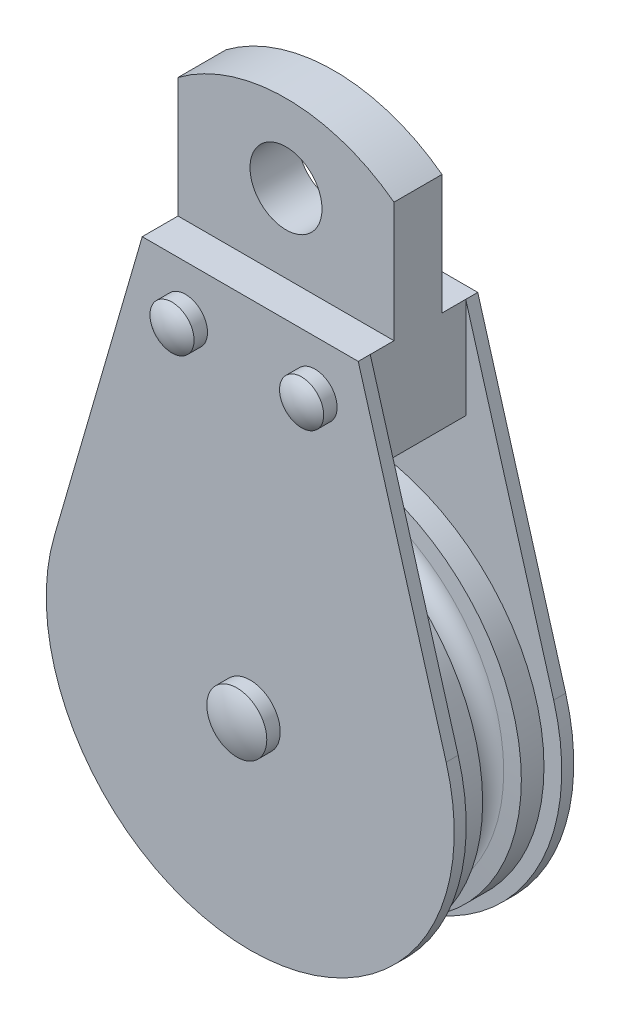
ISO-10303-21;
HEADER;
FILE_DESCRIPTION(('STEP AP214'),'2;1');
FILE_NAME('part.step','',(''),(''),'','','');
FILE_SCHEMA(('AUTOMOTIVE_DESIGN { 1 0 10303 214 1 1 1 1 }'));
ENDSEC;
DATA;
#1=APPLICATION_CONTEXT('core data for automotive mechanical design processes');
#2=APPLICATION_PROTOCOL_DEFINITION('international standard','automotive_design',2000,#1);
#3=PRODUCT_CONTEXT('',#1,'mechanical');
#4=PRODUCT('Part','Part','',(#3));
#5=PRODUCT_RELATED_PRODUCT_CATEGORY('part','',(#4));
#6=PRODUCT_DEFINITION_FORMATION('','',#4);
#7=PRODUCT_DEFINITION_CONTEXT('part definition',#1,'design');
#8=PRODUCT_DEFINITION('design','',#6,#7);
#9=PRODUCT_DEFINITION_SHAPE('','',#8);
#10=(LENGTH_UNIT() NAMED_UNIT(*) SI_UNIT(.MILLI.,.METRE.));
#11=(NAMED_UNIT(*) PLANE_ANGLE_UNIT() SI_UNIT($,.RADIAN.));
#12=(NAMED_UNIT(*) SI_UNIT($,.STERADIAN.) SOLID_ANGLE_UNIT());
#13=UNCERTAINTY_MEASURE_WITH_UNIT(LENGTH_MEASURE(1.E-05),#10,'distance_accuracy_value','');
#14=(GEOMETRIC_REPRESENTATION_CONTEXT(3) GLOBAL_UNCERTAINTY_ASSIGNED_CONTEXT((#13)) GLOBAL_UNIT_ASSIGNED_CONTEXT((#10,
#11,#12)) REPRESENTATION_CONTEXT('',''));
#15=CARTESIAN_POINT('',(0.,0.,0.));
#16=DIRECTION('',(0.,0.,1.));
#17=DIRECTION('',(1.,0.,0.));
#18=AXIS2_PLACEMENT_3D('',#15,#16,#17);
#19=CARTESIAN_POINT('',(0.,0.,-18.0175183923239));
#20=DIRECTION('',(0.,0.,1.));
#21=DIRECTION('',(1.,0.,0.));
#22=AXIS2_PLACEMENT_3D('',#19,#20,#21);
#23=CYLINDRICAL_SURFACE('',#22,3.57505);
#24=CARTESIAN_POINT('',(0.,0.,5.55625));
#25=DIRECTION('',(0.,0.,-1.));
#26=DIRECTION('',(-1.,0.,0.));
#27=AXIS2_PLACEMENT_3D('',#24,#25,#26);
#28=CIRCLE('',#27,3.57505);
#29=CARTESIAN_POINT('',(-3.57505,0.,5.55625));
#30=VERTEX_POINT('',#29);
#31=EDGE_CURVE('E283',#30,#30,#28,.T.);
#32=ORIENTED_EDGE('',*,*,#31,.F.);
#33=EDGE_LOOP('',(#32));
#34=FACE_BOUND('',#33,.T.);
#35=CARTESIAN_POINT('',(0.,0.,6.31825));
#36=DIRECTION('',(0.,0.,1.));
#37=DIRECTION('',(1.,0.,0.));
#38=AXIS2_PLACEMENT_3D('',#35,#36,#37);
#39=CIRCLE('',#38,3.57505);
#40=CARTESIAN_POINT('',(3.57505,0.,6.31825));
#41=VERTEX_POINT('',#40);
#42=EDGE_CURVE('E37',#41,#41,#39,.F.);
#43=ORIENTED_EDGE('',*,*,#42,.T.);
#44=EDGE_LOOP('',(#43));
#45=FACE_BOUND('',#44,.T.);
#46=ADVANCED_FACE('F33',(#34,#45),#23,.T.);
#47=CARTESIAN_POINT('',(0.,0.,-5.55625));
#48=DIRECTION('',(0.,0.,1.));
#49=DIRECTION('',(1.,0.,0.));
#50=AXIS2_PLACEMENT_3D('',#47,#48,#49);
#51=CIRCLE('',#50,3.57505);
#52=CARTESIAN_POINT('',(3.57505,0.,-5.55625));
#53=VERTEX_POINT('',#52);
#54=EDGE_CURVE('E279',#53,#53,#51,.T.);
#55=ORIENTED_EDGE('',*,*,#54,.F.);
#56=EDGE_LOOP('',(#55));
#57=FACE_BOUND('',#56,.T.);
#58=CARTESIAN_POINT('',(0.,0.,-6.31825));
#59=DIRECTION('',(0.,0.,-1.));
#60=DIRECTION('',(-1.,0.,0.));
#61=AXIS2_PLACEMENT_3D('',#58,#59,#60);
#62=CIRCLE('',#61,3.57505);
#63=CARTESIAN_POINT('',(-3.57505,0.,-6.31825));
#64=VERTEX_POINT('',#63);
#65=EDGE_CURVE('E253',#64,#64,#62,.F.);
#66=ORIENTED_EDGE('',*,*,#65,.T.);
#67=EDGE_LOOP('',(#66));
#68=FACE_BOUND('',#67,.T.);
#69=ADVANCED_FACE('F367',(#57,#68),#23,.T.);
#70=CARTESIAN_POINT('',(0.,0.,5.55625));
#71=DIRECTION('',(0.,0.,1.));
#72=DIRECTION('',(1.,0.,0.));
#73=AXIS2_PLACEMENT_3D('',#70,#71,#72);
#74=CYLINDRICAL_SURFACE('',#73,25.4);
#75=CARTESIAN_POINT('',(0.,0.,5.55625));
#76=DIRECTION('',(0.,0.,1.));
#77=DIRECTION('',(1.,0.,0.));
#78=AXIS2_PLACEMENT_3D('',#75,#76,#77);
#79=CIRCLE('',#78,25.4);
#80=CARTESIAN_POINT('',(25.4,0.,5.55625));
#81=VERTEX_POINT('',#80);
#82=EDGE_CURVE('E282',#81,#81,#79,.T.);
#83=ORIENTED_EDGE('',*,*,#82,.F.);
#84=EDGE_LOOP('',(#83));
#85=FACE_BOUND('',#84,.T.);
#86=CARTESIAN_POINT('',(0.,0.,2.55978965723393));
#87=DIRECTION('',(0.,0.,1.));
#88=DIRECTION('',(1.,0.,0.));
#89=AXIS2_PLACEMENT_3D('',#86,#87,#88);
#90=CIRCLE('',#89,25.4);
#91=CARTESIAN_POINT('',(25.4,0.,2.55978965723393));
#92=VERTEX_POINT('',#91);
#93=EDGE_CURVE('E11',#92,#92,#90,.T.);
#94=ORIENTED_EDGE('',*,*,#93,.T.);
#95=EDGE_LOOP('',(#94));
#96=FACE_BOUND('',#95,.T.);
#97=ADVANCED_FACE('F35',(#85,#96),#74,.T.);
#98=CARTESIAN_POINT('',(0.,0.,2.37218862483097));
#99=DIRECTION('',(0.,0.,1.));
#100=DIRECTION('',(1.,0.,0.));
#101=AXIS2_PLACEMENT_3D('',#98,#99,#100);
#102=CONICAL_SURFACE('',#101,23.2557103875821,1.48352986419518);
#103=ORIENTED_EDGE('',*,*,#93,.F.);
#104=EDGE_LOOP('',(#103));
#105=FACE_BOUND('',#104,.T.);
#106=CARTESIAN_POINT('',(0.,0.,2.37218862483097));
#107=DIRECTION('',(0.,0.,1.));
#108=DIRECTION('',(1.,0.,0.));
#109=AXIS2_PLACEMENT_3D('',#106,#107,#108);
#110=CIRCLE('',#109,23.2557103875821);
#111=CARTESIAN_POINT('',(23.2557103875821,0.,2.37218862483097));
#112=VERTEX_POINT('',#111);
#113=EDGE_CURVE('E42',#112,#112,#110,.T.);
#114=ORIENTED_EDGE('',*,*,#113,.T.);
#115=EDGE_LOOP('',(#114));
#116=FACE_BOUND('',#115,.T.);
#117=ADVANCED_FACE('F397',(#105,#116),#102,.T.);
#118=CARTESIAN_POINT('',(0.,0.,0.));
#119=DIRECTION('',(0.,0.,1.));
#120=DIRECTION('',(1.,0.,0.));
#121=AXIS2_PLACEMENT_3D('',#118,#119,#120);
#122=TOROIDAL_SURFACE('',#121,23.46325,2.38125);
#123=ORIENTED_EDGE('',*,*,#113,.F.);
#124=EDGE_LOOP('',(#123));
#125=FACE_BOUND('',#124,.T.);
#126=CARTESIAN_POINT('',(0.,0.,-2.37218862483097));
#127=DIRECTION('',(0.,0.,1.));
#128=DIRECTION('',(1.,0.,0.));
#129=AXIS2_PLACEMENT_3D('',#126,#127,#128);
#130=CIRCLE('',#129,23.2557103875821);
#131=CARTESIAN_POINT('',(23.2557103875821,0.,-2.37218862483097));
#132=VERTEX_POINT('',#131);
#133=EDGE_CURVE('E292',#132,#132,#130,.T.);
#134=ORIENTED_EDGE('',*,*,#133,.T.);
#135=EDGE_LOOP('',(#134));
#136=FACE_BOUND('',#135,.T.);
#137=ADVANCED_FACE('F394',(#125,#136),#122,.F.);
#138=CARTESIAN_POINT('',(0.,0.,-2.55978965723393));
#139=DIRECTION('',(0.,0.,-1.));
#140=DIRECTION('',(-1.,0.,0.));
#141=AXIS2_PLACEMENT_3D('',#138,#139,#140);
#142=CONICAL_SURFACE('',#141,25.4,1.48352986419518);
#143=ORIENTED_EDGE('',*,*,#133,.F.);
#144=EDGE_LOOP('',(#143));
#145=FACE_BOUND('',#144,.T.);
#146=CARTESIAN_POINT('',(0.,0.,-2.55978965723393));
#147=DIRECTION('',(0.,0.,1.));
#148=DIRECTION('',(1.,0.,0.));
#149=AXIS2_PLACEMENT_3D('',#146,#147,#148);
#150=CIRCLE('',#149,25.4);
#151=CARTESIAN_POINT('',(25.4,0.,-2.55978965723393));
#152=VERTEX_POINT('',#151);
#153=EDGE_CURVE('E289',#152,#152,#150,.T.);
#154=ORIENTED_EDGE('',*,*,#153,.T.);
#155=EDGE_LOOP('',(#154));
#156=FACE_BOUND('',#155,.T.);
#157=ADVANCED_FACE('F390',(#145,#156),#142,.T.);
#158=CARTESIAN_POINT('',(0.,0.,5.55625));
#159=DIRECTION('',(0.,0.,1.));
#160=DIRECTION('',(1.,0.,0.));
#161=AXIS2_PLACEMENT_3D('',#158,#159,#160);
#162=CYLINDRICAL_SURFACE('',#161,25.4);
#163=ORIENTED_EDGE('',*,*,#153,.F.);
#164=EDGE_LOOP('',(#163));
#165=FACE_BOUND('',#164,.T.);
#166=CARTESIAN_POINT('',(0.,0.,-5.55625));
#167=DIRECTION('',(0.,0.,1.));
#168=DIRECTION('',(1.,0.,0.));
#169=AXIS2_PLACEMENT_3D('',#166,#167,#168);
#170=CIRCLE('',#169,25.4);
#171=CARTESIAN_POINT('',(25.4,0.,-5.55625));
#172=VERTEX_POINT('',#171);
#173=EDGE_CURVE('E286',#172,#172,#170,.T.);
#174=ORIENTED_EDGE('',*,*,#173,.T.);
#175=EDGE_LOOP('',(#174));
#176=FACE_BOUND('',#175,.T.);
#177=ADVANCED_FACE('F386',(#165,#176),#162,.T.);
#178=CARTESIAN_POINT('',(0.,0.,-5.55625));
#179=DIRECTION('',(0.,0.,1.));
#180=DIRECTION('',(1.,0.,0.));
#181=AXIS2_PLACEMENT_3D('',#178,#179,#180);
#182=PLANE('',#181);
#183=ORIENTED_EDGE('',*,*,#54,.T.);
#184=EDGE_LOOP('',(#183));
#185=FACE_BOUND('',#184,.T.);
#186=ORIENTED_EDGE('',*,*,#173,.F.);
#187=EDGE_LOOP('',(#186));
#188=FACE_BOUND('',#187,.T.);
#189=ADVANCED_FACE('F382',(#185,#188),#182,.F.);
#190=CARTESIAN_POINT('',(0.,25.4,5.55625));
#191=DIRECTION('',(0.,0.,-1.));
#192=DIRECTION('',(-1.,0.,0.));
#193=AXIS2_PLACEMENT_3D('',#190,#191,#192);
#194=PLANE('',#193);
#195=ORIENTED_EDGE('',*,*,#31,.T.);
#196=EDGE_LOOP('',(#195));
#197=FACE_BOUND('',#196,.T.);
#198=ORIENTED_EDGE('',*,*,#82,.T.);
#199=EDGE_LOOP('',(#198));
#200=FACE_BOUND('',#199,.T.);
#201=ADVANCED_FACE('F379',(#197,#200),#194,.F.);
#202=CARTESIAN_POINT('',(0.,0.,-7.90575));
#203=DIRECTION('',(0.,0.,-1.));
#204=DIRECTION('',(1.,0.,0.));
#205=AXIS2_PLACEMENT_3D('',#202,#203,#204);
#206=PLANE('',#205);
#207=CARTESIAN_POINT('',(-8.57249999999999,40.9575,-7.90575));
#208=DIRECTION('',(0.,0.,-1.));
#209=DIRECTION('',(-1.,0.,0.));
#210=AXIS2_PLACEMENT_3D('',#207,#208,#209);
#211=CIRCLE('',#210,4.19100000000001);
#212=CARTESIAN_POINT('',(-12.7635,40.9575,-7.90575));
#213=VERTEX_POINT('',#212);
#214=EDGE_CURVE('E274',#213,#213,#211,.T.);
#215=ORIENTED_EDGE('',*,*,#214,.F.);
#216=EDGE_LOOP('',(#215));
#217=FACE_BOUND('',#216,.T.);
#218=DIRECTION('',(-0.278539209089311,-0.960424858591187,0.));
#219=VECTOR('',#218,1.);
#220=CARTESIAN_POINT('',(-14.2875,47.625,-7.90575));
#221=LINE('',#220,#219);
#222=CARTESIAN_POINT('',(-14.2875,47.625,-7.90575));
#223=VERTEX_POINT('',#222);
#224=CARTESIAN_POINT('',(-25.9194658712297,7.51707690529776,-7.90575));
#225=VERTEX_POINT('',#224);
#226=EDGE_CURVE('E178',#223,#225,#221,.T.);
#227=ORIENTED_EDGE('',*,*,#226,.F.);
#228=DIRECTION('',(-1.,0.,0.));
#229=VECTOR('',#228,1.);
#230=CARTESIAN_POINT('',(14.2875,47.625,-7.90575));
#231=LINE('',#230,#229);
#232=CARTESIAN_POINT('',(14.2875,47.625,-7.90575));
#233=VERTEX_POINT('',#232);
#234=EDGE_CURVE('E188',#233,#223,#231,.T.);
#235=ORIENTED_EDGE('',*,*,#234,.F.);
#236=DIRECTION('',(-0.27853920908931,0.960424858591187,0.));
#237=VECTOR('',#236,1.);
#238=CARTESIAN_POINT('',(25.9194658712297,7.51707690529777,-7.90575));
#239=LINE('',#238,#237);
#240=CARTESIAN_POINT('',(25.9194658712297,7.51707690529777,-7.90575));
#241=VERTEX_POINT('',#240);
#242=EDGE_CURVE('E185',#241,#233,#239,.T.);
#243=ORIENTED_EDGE('',*,*,#242,.F.);
#244=CARTESIAN_POINT('',(0.,0.,-7.90575));
#245=DIRECTION('',(0.,0.,1.));
#246=DIRECTION('',(1.,0.,0.));
#247=AXIS2_PLACEMENT_3D('',#244,#245,#246);
#248=CIRCLE('',#247,26.9875);
#249=EDGE_CURVE('E181',#225,#241,#248,.T.);
#250=ORIENTED_EDGE('',*,*,#249,.F.);
#251=EDGE_LOOP('',(#227,#235,#243,#250));
#252=FACE_BOUND('',#251,.T.);
#253=CARTESIAN_POINT('',(8.5725,40.9575,-7.90575));
#254=DIRECTION('',(0.,0.,-1.));
#255=DIRECTION('',(-1.,0.,0.));
#256=AXIS2_PLACEMENT_3D('',#253,#254,#255);
#257=CIRCLE('',#256,4.19100000000001);
#258=CARTESIAN_POINT('',(4.3815,40.9575,-7.90575));
#259=VERTEX_POINT('',#258);
#260=EDGE_CURVE('E270',#259,#259,#257,.T.);
#261=ORIENTED_EDGE('',*,*,#260,.F.);
#262=EDGE_LOOP('',(#261));
#263=FACE_BOUND('',#262,.T.);
#264=CARTESIAN_POINT('',(0.,0.,-7.90575));
#265=DIRECTION('',(0.,0.,-1.));
#266=DIRECTION('',(-1.,0.,0.));
#267=AXIS2_PLACEMENT_3D('',#264,#265,#266);
#268=CIRCLE('',#267,6.35);
#269=CARTESIAN_POINT('',(-6.35,0.,-7.90575));
#270=VERTEX_POINT('',#269);
#271=EDGE_CURVE('E278',#270,#270,#268,.T.);
#272=ORIENTED_EDGE('',*,*,#271,.F.);
#273=EDGE_LOOP('',(#272));
#274=FACE_BOUND('',#273,.T.);
#275=ADVANCED_FACE('F348',(#217,#252,#263,#274),#206,.T.);
#276=CARTESIAN_POINT('',(0.,0.,7.90575));
#277=DIRECTION('',(0.,0.,1.));
#278=DIRECTION('',(1.,0.,0.));
#279=AXIS2_PLACEMENT_3D('',#276,#277,#278);
#280=PLANE('',#279);
#281=CARTESIAN_POINT('',(-8.57249999999999,40.9575,7.90575));
#282=DIRECTION('',(0.,0.,1.));
#283=DIRECTION('',(1.,0.,0.));
#284=AXIS2_PLACEMENT_3D('',#281,#282,#283);
#285=CIRCLE('',#284,2.921);
#286=CARTESIAN_POINT('',(-5.65149999999999,40.9575,7.90575));
#287=VERTEX_POINT('',#286);
#288=EDGE_CURVE('E258',#287,#287,#285,.T.);
#289=ORIENTED_EDGE('',*,*,#288,.F.);
#290=EDGE_LOOP('',(#289));
#291=FACE_BOUND('',#290,.T.);
#292=DIRECTION('',(-0.278539209089311,-0.960424858591187,0.));
#293=VECTOR('',#292,1.);
#294=CARTESIAN_POINT('',(-14.2875,47.625,7.90575));
#295=LINE('',#294,#293);
#296=CARTESIAN_POINT('',(-14.2875,47.625,7.90575));
#297=VERTEX_POINT('',#296);
#298=CARTESIAN_POINT('',(-25.9194658712297,7.51707690529776,7.90575));
#299=VERTEX_POINT('',#298);
#300=EDGE_CURVE('E225',#297,#299,#295,.T.);
#301=ORIENTED_EDGE('',*,*,#300,.T.);
#302=CARTESIAN_POINT('',(0.,0.,7.90575));
#303=DIRECTION('',(0.,0.,1.));
#304=DIRECTION('',(1.,0.,0.));
#305=AXIS2_PLACEMENT_3D('',#302,#303,#304);
#306=CIRCLE('',#305,26.9875);
#307=CARTESIAN_POINT('',(25.9194658712297,7.51707690529777,7.90575));
#308=VERTEX_POINT('',#307);
#309=EDGE_CURVE('E228',#299,#308,#306,.T.);
#310=ORIENTED_EDGE('',*,*,#309,.T.);
#311=DIRECTION('',(-0.27853920908931,0.960424858591187,0.));
#312=VECTOR('',#311,1.);
#313=CARTESIAN_POINT('',(25.9194658712297,7.51707690529777,7.90575));
#314=LINE('',#313,#312);
#315=CARTESIAN_POINT('',(14.2875,47.625,7.90575));
#316=VERTEX_POINT('',#315);
#317=EDGE_CURVE('E231',#308,#316,#314,.T.);
#318=ORIENTED_EDGE('',*,*,#317,.T.);
#319=DIRECTION('',(-1.,0.,0.));
#320=VECTOR('',#319,1.);
#321=CARTESIAN_POINT('',(14.2875,47.625,7.90575));
#322=LINE('',#321,#320);
#323=EDGE_CURVE('E233',#316,#297,#322,.T.);
#324=ORIENTED_EDGE('',*,*,#323,.T.);
#325=EDGE_LOOP('',(#301,#310,#318,#324));
#326=FACE_BOUND('',#325,.T.);
#327=CARTESIAN_POINT('',(0.,0.,7.90575));
#328=DIRECTION('',(0.,0.,1.));
#329=DIRECTION('',(1.,0.,0.));
#330=AXIS2_PLACEMENT_3D('',#327,#328,#329);
#331=CIRCLE('',#330,3.96875);
#332=CARTESIAN_POINT('',(3.96875,0.,7.90575));
#333=VERTEX_POINT('',#332);
#334=EDGE_CURVE('E257',#333,#333,#331,.T.);
#335=ORIENTED_EDGE('',*,*,#334,.F.);
#336=EDGE_LOOP('',(#335));
#337=FACE_BOUND('',#336,.T.);
#338=CARTESIAN_POINT('',(8.5725,40.9575,7.90575));
#339=DIRECTION('',(0.,0.,1.));
#340=DIRECTION('',(1.,0.,0.));
#341=AXIS2_PLACEMENT_3D('',#338,#339,#340);
#342=CIRCLE('',#341,2.921);
#343=CARTESIAN_POINT('',(11.4935,40.9575,7.90575));
#344=VERTEX_POINT('',#343);
#345=EDGE_CURVE('E262',#344,#344,#342,.T.);
#346=ORIENTED_EDGE('',*,*,#345,.F.);
#347=EDGE_LOOP('',(#346));
#348=FACE_BOUND('',#347,.T.);
#349=ADVANCED_FACE('F326',(#291,#326,#337,#348),#280,.T.);
#350=CARTESIAN_POINT('',(14.2875,47.625,7.90575));
#351=DIRECTION('',(0.,-1.,0.));
#352=DIRECTION('',(0.,0.,-1.));
#353=AXIS2_PLACEMENT_3D('',#350,#351,#352);
#354=PLANE('',#353);
#355=DIRECTION('',(-1.,0.,0.));
#356=VECTOR('',#355,1.);
#357=CARTESIAN_POINT('',(14.2875,47.625,-3.175));
#358=LINE('',#357,#356);
#359=CARTESIAN_POINT('',(14.2875,47.625,-3.175));
#360=VERTEX_POINT('',#359);
#361=CARTESIAN_POINT('',(-14.2875,47.625,-3.175));
#362=VERTEX_POINT('',#361);
#363=EDGE_CURVE('E159',#360,#362,#358,.T.);
#364=ORIENTED_EDGE('',*,*,#363,.F.);
#365=DIRECTION('',(0.,0.,1.));
#366=VECTOR('',#365,1.);
#367=CARTESIAN_POINT('',(14.2875,47.625,-31.5333609055553));
#368=LINE('',#367,#366);
#369=CARTESIAN_POINT('',(14.2875,47.625,-6.31825));
#370=VERTEX_POINT('',#369);
#371=EDGE_CURVE('E215',#370,#360,#368,.T.);
#372=ORIENTED_EDGE('',*,*,#371,.F.);
#373=DIRECTION('',(0.,0.,1.));
#374=VECTOR('',#373,1.);
#375=CARTESIAN_POINT('',(14.2875,47.625,-7.90575));
#376=LINE('',#375,#374);
#377=EDGE_CURVE('E200',#233,#370,#376,.T.);
#378=ORIENTED_EDGE('',*,*,#377,.F.);
#379=ORIENTED_EDGE('',*,*,#234,.T.);
#380=DIRECTION('',(0.,0.,1.));
#381=VECTOR('',#380,1.);
#382=CARTESIAN_POINT('',(-14.2875,47.625,-7.90575));
#383=LINE('',#382,#381);
#384=CARTESIAN_POINT('',(-14.2875,47.625,-6.31825));
#385=VERTEX_POINT('',#384);
#386=EDGE_CURVE('E190',#223,#385,#383,.T.);
#387=ORIENTED_EDGE('',*,*,#386,.T.);
#388=DIRECTION('',(0.,0.,1.));
#389=VECTOR('',#388,1.);
#390=CARTESIAN_POINT('',(-14.2875,47.625,-31.5333609055553));
#391=LINE('',#390,#389);
#392=EDGE_CURVE('E218',#385,#362,#391,.T.);
#393=ORIENTED_EDGE('',*,*,#392,.T.);
#394=EDGE_LOOP('',(#364,#372,#378,#379,#387,#393));
#395=FACE_BOUND('',#394,.T.);
#396=ADVANCED_FACE('F309',(#395),#354,.F.);
#397=CARTESIAN_POINT('',(0.,0.,6.31825));
#398=DIRECTION('',(0.,0.,1.));
#399=DIRECTION('',(1.,0.,0.));
#400=AXIS2_PLACEMENT_3D('',#397,#398,#399);
#401=PLANE('',#400);
#402=ORIENTED_EDGE('',*,*,#42,.F.);
#403=EDGE_LOOP('',(#402));
#404=FACE_BOUND('',#403,.T.);
#405=DIRECTION('',(0.,-1.,0.));
#406=VECTOR('',#405,1.);
#407=CARTESIAN_POINT('',(14.2875,47.625,6.31825));
#408=LINE('',#407,#406);
#409=CARTESIAN_POINT('',(14.2875,47.625,6.31825));
#410=VERTEX_POINT('',#409);
#411=CARTESIAN_POINT('',(14.2875,34.29,6.31825));
#412=VERTEX_POINT('',#411);
#413=EDGE_CURVE('E207',#410,#412,#408,.T.);
#414=ORIENTED_EDGE('',*,*,#413,.F.);
#415=DIRECTION('',(-0.27853920908931,0.960424858591187,0.));
#416=VECTOR('',#415,1.);
#417=CARTESIAN_POINT('',(25.9194658712297,7.51707690529777,6.31825));
#418=LINE('',#417,#416);
#419=CARTESIAN_POINT('',(25.9194658712297,7.51707690529777,6.31825));
#420=VERTEX_POINT('',#419);
#421=EDGE_CURVE('E229',#420,#410,#418,.T.);
#422=ORIENTED_EDGE('',*,*,#421,.F.);
#423=CARTESIAN_POINT('',(0.,0.,6.31825));
#424=DIRECTION('',(0.,0.,1.));
#425=DIRECTION('',(1.,0.,0.));
#426=AXIS2_PLACEMENT_3D('',#423,#424,#425);
#427=CIRCLE('',#426,26.9875);
#428=CARTESIAN_POINT('',(-25.9194658712297,7.51707690529776,6.31825));
#429=VERTEX_POINT('',#428);
#430=EDGE_CURVE('E238',#429,#420,#427,.T.);
#431=ORIENTED_EDGE('',*,*,#430,.F.);
#432=DIRECTION('',(-0.278539209089311,-0.960424858591187,0.));
#433=VECTOR('',#432,1.);
#434=CARTESIAN_POINT('',(-14.2875,47.625,6.31825));
#435=LINE('',#434,#433);
#436=CARTESIAN_POINT('',(-14.2875,47.625,6.31825));
#437=VERTEX_POINT('',#436);
#438=EDGE_CURVE('E224',#437,#429,#435,.T.);
#439=ORIENTED_EDGE('',*,*,#438,.F.);
#440=DIRECTION('',(0.,1.,0.));
#441=VECTOR('',#440,1.);
#442=CARTESIAN_POINT('',(-14.2875,47.625,6.31825));
#443=LINE('',#442,#441);
#444=CARTESIAN_POINT('',(-14.2875,34.29,6.31825));
#445=VERTEX_POINT('',#444);
#446=EDGE_CURVE('E212',#445,#437,#443,.T.);
#447=ORIENTED_EDGE('',*,*,#446,.F.);
#448=DIRECTION('',(-1.,0.,0.));
#449=VECTOR('',#448,1.);
#450=CARTESIAN_POINT('',(14.2875,34.29,6.31825));
#451=LINE('',#450,#449);
#452=EDGE_CURVE('E210',#412,#445,#451,.T.);
#453=ORIENTED_EDGE('',*,*,#452,.F.);
#454=EDGE_LOOP('',(#414,#422,#431,#439,#447,#453));
#455=FACE_BOUND('',#454,.T.);
#456=ADVANCED_FACE('F305',(#404,#455),#401,.F.);
#457=CARTESIAN_POINT('',(-14.2875,47.625,7.90575));
#458=DIRECTION('',(0.960424858591187,-0.278539209089311,0.));
#459=DIRECTION('',(0.278539209089311,0.960424858591187,0.));
#460=AXIS2_PLACEMENT_3D('',#457,#458,#459);
#461=PLANE('',#460);
#462=ORIENTED_EDGE('',*,*,#438,.T.);
#463=DIRECTION('',(0.,0.,-1.));
#464=VECTOR('',#463,1.);
#465=CARTESIAN_POINT('',(-25.9194658712297,7.51707690529776,7.90575));
#466=LINE('',#465,#464);
#467=EDGE_CURVE('E250',#299,#429,#466,.T.);
#468=ORIENTED_EDGE('',*,*,#467,.F.);
#469=ORIENTED_EDGE('',*,*,#300,.F.);
#470=DIRECTION('',(0.,0.,-1.));
#471=VECTOR('',#470,1.);
#472=CARTESIAN_POINT('',(-14.2875,47.625,7.90575));
#473=LINE('',#472,#471);
#474=EDGE_CURVE('E235',#297,#437,#473,.T.);
#475=ORIENTED_EDGE('',*,*,#474,.T.);
#476=EDGE_LOOP('',(#462,#468,#469,#475));
#477=FACE_BOUND('',#476,.T.);
#478=ADVANCED_FACE('F308',(#477),#461,.F.);
#479=CARTESIAN_POINT('',(0.,0.,7.90575));
#480=DIRECTION('',(0.,0.,-1.));
#481=DIRECTION('',(-1.,0.,0.));
#482=AXIS2_PLACEMENT_3D('',#479,#480,#481);
#483=CYLINDRICAL_SURFACE('',#482,26.9875);
#484=ORIENTED_EDGE('',*,*,#430,.T.);
#485=DIRECTION('',(0.,0.,-1.));
#486=VECTOR('',#485,1.);
#487=CARTESIAN_POINT('',(25.9194658712297,7.51707690529777,7.90575));
#488=LINE('',#487,#486);
#489=EDGE_CURVE('E247',#308,#420,#488,.T.);
#490=ORIENTED_EDGE('',*,*,#489,.F.);
#491=ORIENTED_EDGE('',*,*,#309,.F.);
#492=ORIENTED_EDGE('',*,*,#467,.T.);
#493=EDGE_LOOP('',(#484,#490,#491,#492));
#494=FACE_BOUND('',#493,.T.);
#495=ADVANCED_FACE('F330',(#494),#483,.T.);
#496=CARTESIAN_POINT('',(25.9194658712297,7.51707690529777,7.90575));
#497=DIRECTION('',(-0.960424858591187,-0.27853920908931,0.));
#498=DIRECTION('',(0.278539209089311,-0.960424858591187,0.));
#499=AXIS2_PLACEMENT_3D('',#496,#497,#498);
#500=PLANE('',#499);
#501=ORIENTED_EDGE('',*,*,#421,.T.);
#502=DIRECTION('',(0.,0.,-1.));
#503=VECTOR('',#502,1.);
#504=CARTESIAN_POINT('',(14.2875,47.625,7.90575));
#505=LINE('',#504,#503);
#506=EDGE_CURVE('E244',#316,#410,#505,.T.);
#507=ORIENTED_EDGE('',*,*,#506,.F.);
#508=ORIENTED_EDGE('',*,*,#317,.F.);
#509=ORIENTED_EDGE('',*,*,#489,.T.);
#510=EDGE_LOOP('',(#501,#507,#508,#509));
#511=FACE_BOUND('',#510,.T.);
#512=ADVANCED_FACE('F316',(#511),#500,.F.);
#513=CARTESIAN_POINT('',(14.2875,47.625,3.175));
#514=VERTEX_POINT('',#513);
#515=EDGE_CURVE('E214',#514,#410,#368,.T.);
#516=ORIENTED_EDGE('',*,*,#515,.F.);
#517=DIRECTION('',(-1.,0.,0.));
#518=VECTOR('',#517,1.);
#519=CARTESIAN_POINT('',(14.2875,47.625,3.175));
#520=LINE('',#519,#518);
#521=CARTESIAN_POINT('',(-14.2875,47.625,3.175));
#522=VERTEX_POINT('',#521);
#523=EDGE_CURVE('E162',#514,#522,#520,.T.);
#524=ORIENTED_EDGE('',*,*,#523,.T.);
#525=EDGE_CURVE('E145',#522,#437,#391,.T.);
#526=ORIENTED_EDGE('',*,*,#525,.T.);
#527=ORIENTED_EDGE('',*,*,#474,.F.);
#528=ORIENTED_EDGE('',*,*,#323,.F.);
#529=ORIENTED_EDGE('',*,*,#506,.T.);
#530=EDGE_LOOP('',(#516,#524,#526,#527,#528,#529));
#531=FACE_BOUND('',#530,.T.);
#532=ADVANCED_FACE('F322',(#531),#354,.F.);
#533=CARTESIAN_POINT('',(-14.2875,47.625,-31.5333609055553));
#534=DIRECTION('',(1.,0.,0.));
#535=DIRECTION('',(0.,1.,0.));
#536=AXIS2_PLACEMENT_3D('',#533,#534,#535);
#537=PLANE('',#536);
#538=ORIENTED_EDGE('',*,*,#525,.F.);
#539=DIRECTION('',(0.,-1.,0.));
#540=VECTOR('',#539,1.);
#541=CARTESIAN_POINT('',(-14.2875,63.5,3.175));
#542=LINE('',#541,#540);
#543=CARTESIAN_POINT('',(-14.2875,63.5,3.175));
#544=VERTEX_POINT('',#543);
#545=EDGE_CURVE('E137',#544,#522,#542,.T.);
#546=ORIENTED_EDGE('',*,*,#545,.F.);
#547=DIRECTION('',(0.,0.,-1.));
#548=VECTOR('',#547,1.);
#549=CARTESIAN_POINT('',(-14.2875,63.5,3.175));
#550=LINE('',#549,#548);
#551=CARTESIAN_POINT('',(-14.2875,63.5,-3.175));
#552=VERTEX_POINT('',#551);
#553=EDGE_CURVE('E142',#544,#552,#550,.T.);
#554=ORIENTED_EDGE('',*,*,#553,.T.);
#555=DIRECTION('',(0.,-1.,0.));
#556=VECTOR('',#555,1.);
#557=CARTESIAN_POINT('',(-14.2875,63.5,-3.175));
#558=LINE('',#557,#556);
#559=EDGE_CURVE('E745',#552,#362,#558,.T.);
#560=ORIENTED_EDGE('',*,*,#559,.T.);
#561=ORIENTED_EDGE('',*,*,#392,.F.);
#562=DIRECTION('',(0.,1.,0.));
#563=VECTOR('',#562,1.);
#564=CARTESIAN_POINT('',(-14.2875,47.625,-6.31825));
#565=LINE('',#564,#563);
#566=CARTESIAN_POINT('',(-14.2875,34.29,-6.31825));
#567=VERTEX_POINT('',#566);
#568=EDGE_CURVE('E174',#567,#385,#565,.T.);
#569=ORIENTED_EDGE('',*,*,#568,.F.);
#570=DIRECTION('',(0.,0.,1.));
#571=VECTOR('',#570,1.);
#572=CARTESIAN_POINT('',(-14.2875,34.29,-31.5333609055553));
#573=LINE('',#572,#571);
#574=EDGE_CURVE('E221',#567,#445,#573,.T.);
#575=ORIENTED_EDGE('',*,*,#574,.T.);
#576=ORIENTED_EDGE('',*,*,#446,.T.);
#577=EDGE_LOOP('',(#538,#546,#554,#560,#561,#569,#575,#576));
#578=FACE_BOUND('',#577,.T.);
#579=ADVANCED_FACE('F139',(#578),#537,.F.);
#580=CARTESIAN_POINT('',(14.2875,34.29,-31.5333609055553));
#581=DIRECTION('',(0.,1.,0.));
#582=DIRECTION('',(0.,0.,1.));
#583=AXIS2_PLACEMENT_3D('',#580,#581,#582);
#584=PLANE('',#583);
#585=ORIENTED_EDGE('',*,*,#452,.T.);
#586=ORIENTED_EDGE('',*,*,#574,.F.);
#587=DIRECTION('',(-1.,0.,0.));
#588=VECTOR('',#587,1.);
#589=CARTESIAN_POINT('',(14.2875,34.29,-6.31825));
#590=LINE('',#589,#588);
#591=CARTESIAN_POINT('',(14.2875,34.29,-6.31825));
#592=VERTEX_POINT('',#591);
#593=EDGE_CURVE('E171',#592,#567,#590,.T.);
#594=ORIENTED_EDGE('',*,*,#593,.F.);
#595=DIRECTION('',(0.,0.,1.));
#596=VECTOR('',#595,1.);
#597=CARTESIAN_POINT('',(14.2875,34.29,-31.5333609055553));
#598=LINE('',#597,#596);
#599=EDGE_CURVE('E58',#592,#412,#598,.T.);
#600=ORIENTED_EDGE('',*,*,#599,.T.);
#601=EDGE_LOOP('',(#585,#586,#594,#600));
#602=FACE_BOUND('',#601,.T.);
#603=ADVANCED_FACE('F334',(#602),#584,.F.);
#604=CARTESIAN_POINT('',(14.2875,47.625,-31.5333609055553));
#605=DIRECTION('',(-1.,0.,0.));
#606=DIRECTION('',(0.,-1.,0.));
#607=AXIS2_PLACEMENT_3D('',#604,#605,#606);
#608=PLANE('',#607);
#609=ORIENTED_EDGE('',*,*,#413,.T.);
#610=ORIENTED_EDGE('',*,*,#599,.F.);
#611=DIRECTION('',(0.,-1.,0.));
#612=VECTOR('',#611,1.);
#613=CARTESIAN_POINT('',(14.2875,47.625,-6.31825));
#614=LINE('',#613,#612);
#615=EDGE_CURVE('E168',#370,#592,#614,.T.);
#616=ORIENTED_EDGE('',*,*,#615,.F.);
#617=ORIENTED_EDGE('',*,*,#371,.T.);
#618=DIRECTION('',(0.,1.,0.));
#619=VECTOR('',#618,1.);
#620=CARTESIAN_POINT('',(14.2875,63.5,-3.175));
#621=LINE('',#620,#619);
#622=CARTESIAN_POINT('',(14.2875,63.5,-3.175));
#623=VERTEX_POINT('',#622);
#624=EDGE_CURVE('E154',#360,#623,#621,.T.);
#625=ORIENTED_EDGE('',*,*,#624,.T.);
#626=DIRECTION('',(0.,0.,-1.));
#627=VECTOR('',#626,1.);
#628=CARTESIAN_POINT('',(14.2875,63.5,3.175));
#629=LINE('',#628,#627);
#630=CARTESIAN_POINT('',(14.2875,63.5,3.175));
#631=VERTEX_POINT('',#630);
#632=EDGE_CURVE('E160',#631,#623,#629,.T.);
#633=ORIENTED_EDGE('',*,*,#632,.F.);
#634=DIRECTION('',(0.,1.,0.));
#635=VECTOR('',#634,1.);
#636=CARTESIAN_POINT('',(14.2875,63.5,3.175));
#637=LINE('',#636,#635);
#638=EDGE_CURVE('E50',#514,#631,#637,.T.);
#639=ORIENTED_EDGE('',*,*,#638,.F.);
#640=ORIENTED_EDGE('',*,*,#515,.T.);
#641=EDGE_LOOP('',(#609,#610,#616,#617,#625,#633,#639,#640));
#642=FACE_BOUND('',#641,.T.);
#643=ADVANCED_FACE('F339',(#642),#608,.F.);
#644=CARTESIAN_POINT('',(0.,0.,-6.31825));
#645=DIRECTION('',(0.,0.,-1.));
#646=DIRECTION('',(1.,0.,0.));
#647=AXIS2_PLACEMENT_3D('',#644,#645,#646);
#648=PLANE('',#647);
#649=ORIENTED_EDGE('',*,*,#65,.F.);
#650=EDGE_LOOP('',(#649));
#651=FACE_BOUND('',#650,.T.);
#652=ORIENTED_EDGE('',*,*,#615,.T.);
#653=ORIENTED_EDGE('',*,*,#593,.T.);
#654=ORIENTED_EDGE('',*,*,#568,.T.);
#655=DIRECTION('',(-0.278539209089311,-0.960424858591187,0.));
#656=VECTOR('',#655,1.);
#657=CARTESIAN_POINT('',(-14.2875,47.625,-6.31825));
#658=LINE('',#657,#656);
#659=CARTESIAN_POINT('',(-25.9194658712297,7.51707690529776,-6.31825));
#660=VERTEX_POINT('',#659);
#661=EDGE_CURVE('E177',#385,#660,#658,.T.);
#662=ORIENTED_EDGE('',*,*,#661,.T.);
#663=CARTESIAN_POINT('',(0.,0.,-6.31825));
#664=DIRECTION('',(0.,0.,1.));
#665=DIRECTION('',(1.,0.,0.));
#666=AXIS2_PLACEMENT_3D('',#663,#664,#665);
#667=CIRCLE('',#666,26.9875);
#668=CARTESIAN_POINT('',(25.9194658712297,7.51707690529777,-6.31825));
#669=VERTEX_POINT('',#668);
#670=EDGE_CURVE('E193',#660,#669,#667,.T.);
#671=ORIENTED_EDGE('',*,*,#670,.T.);
#672=DIRECTION('',(-0.27853920908931,0.960424858591187,0.));
#673=VECTOR('',#672,1.);
#674=CARTESIAN_POINT('',(25.9194658712297,7.51707690529777,-6.31825));
#675=LINE('',#674,#673);
#676=EDGE_CURVE('E182',#669,#370,#675,.T.);
#677=ORIENTED_EDGE('',*,*,#676,.T.);
#678=EDGE_LOOP('',(#652,#653,#654,#662,#671,#677));
#679=FACE_BOUND('',#678,.T.);
#680=ADVANCED_FACE('F337',(#651,#679),#648,.F.);
#681=CARTESIAN_POINT('',(-14.2875,47.625,-7.90575));
#682=DIRECTION('',(0.960424858591187,-0.278539209089311,0.));
#683=DIRECTION('',(0.278539209089311,0.960424858591187,0.));
#684=AXIS2_PLACEMENT_3D('',#681,#682,#683);
#685=PLANE('',#684);
#686=ORIENTED_EDGE('',*,*,#661,.F.);
#687=ORIENTED_EDGE('',*,*,#386,.F.);
#688=ORIENTED_EDGE('',*,*,#226,.T.);
#689=DIRECTION('',(0.,0.,1.));
#690=VECTOR('',#689,1.);
#691=CARTESIAN_POINT('',(-25.9194658712297,7.51707690529776,-7.90575));
#692=LINE('',#691,#690);
#693=EDGE_CURVE('E205',#225,#660,#692,.T.);
#694=ORIENTED_EDGE('',*,*,#693,.T.);
#695=EDGE_LOOP('',(#686,#687,#688,#694));
#696=FACE_BOUND('',#695,.T.);
#697=ADVANCED_FACE('F354',(#696),#685,.F.);
#698=CARTESIAN_POINT('',(0.,0.,-7.90575));
#699=DIRECTION('',(0.,0.,1.));
#700=DIRECTION('',(-1.,0.,0.));
#701=AXIS2_PLACEMENT_3D('',#698,#699,#700);
#702=CYLINDRICAL_SURFACE('',#701,26.9875);
#703=ORIENTED_EDGE('',*,*,#670,.F.);
#704=ORIENTED_EDGE('',*,*,#693,.F.);
#705=ORIENTED_EDGE('',*,*,#249,.T.);
#706=DIRECTION('',(0.,0.,1.));
#707=VECTOR('',#706,1.);
#708=CARTESIAN_POINT('',(25.9194658712297,7.51707690529777,-7.90575));
#709=LINE('',#708,#707);
#710=EDGE_CURVE('E203',#241,#669,#709,.T.);
#711=ORIENTED_EDGE('',*,*,#710,.T.);
#712=EDGE_LOOP('',(#703,#704,#705,#711));
#713=FACE_BOUND('',#712,.T.);
#714=ADVANCED_FACE('F357',(#713),#702,.T.);
#715=CARTESIAN_POINT('',(25.9194658712297,7.51707690529777,-7.90575));
#716=DIRECTION('',(-0.960424858591187,-0.27853920908931,0.));
#717=DIRECTION('',(0.278539209089311,-0.960424858591187,0.));
#718=AXIS2_PLACEMENT_3D('',#715,#716,#717);
#719=PLANE('',#718);
#720=ORIENTED_EDGE('',*,*,#676,.F.);
#721=ORIENTED_EDGE('',*,*,#710,.F.);
#722=ORIENTED_EDGE('',*,*,#242,.T.);
#723=ORIENTED_EDGE('',*,*,#377,.T.);
#724=EDGE_LOOP('',(#720,#721,#722,#723));
#725=FACE_BOUND('',#724,.T.);
#726=ADVANCED_FACE('F344',(#725),#719,.F.);
#727=CARTESIAN_POINT('',(0.,44.45,3.175));
#728=DIRECTION('',(0.,0.,1.));
#729=DIRECTION('',(1.,0.,0.));
#730=AXIS2_PLACEMENT_3D('',#727,#728,#729);
#731=PLANE('',#730);
#732=CARTESIAN_POINT('',(0.,57.94375,3.175));
#733=DIRECTION('',(0.,0.,1.));
#734=DIRECTION('',(1.,0.,0.));
#735=AXIS2_PLACEMENT_3D('',#732,#733,#734);
#736=CIRCLE('',#735,4.7625);
#737=CARTESIAN_POINT('',(4.7625,57.94375,3.175));
#738=VERTEX_POINT('',#737);
#739=EDGE_CURVE('E738',#738,#738,#736,.T.);
#740=ORIENTED_EDGE('',*,*,#739,.F.);
#741=EDGE_LOOP('',(#740));
#742=FACE_BOUND('',#741,.T.);
#743=ORIENTED_EDGE('',*,*,#523,.F.);
#744=ORIENTED_EDGE('',*,*,#638,.T.);
#745=CARTESIAN_POINT('',(0.,44.45,3.175));
#746=DIRECTION('',(0.,0.,1.));
#747=DIRECTION('',(1.,0.,0.));
#748=AXIS2_PLACEMENT_3D('',#745,#746,#747);
#749=CIRCLE('',#748,23.8125);
#750=EDGE_CURVE('E148',#631,#544,#749,.T.);
#751=ORIENTED_EDGE('',*,*,#750,.T.);
#752=ORIENTED_EDGE('',*,*,#545,.T.);
#753=EDGE_LOOP('',(#743,#744,#751,#752));
#754=FACE_BOUND('',#753,.T.);
#755=ADVANCED_FACE('F151',(#742,#754),#731,.T.);
#756=CARTESIAN_POINT('',(0.,44.45,-3.175));
#757=DIRECTION('',(0.,0.,1.));
#758=DIRECTION('',(1.,0.,0.));
#759=AXIS2_PLACEMENT_3D('',#756,#757,#758);
#760=PLANE('',#759);
#761=CARTESIAN_POINT('',(0.,57.94375,-3.175));
#762=DIRECTION('',(0.,0.,1.));
#763=DIRECTION('',(1.,0.,0.));
#764=AXIS2_PLACEMENT_3D('',#761,#762,#763);
#765=CIRCLE('',#764,4.7625);
#766=CARTESIAN_POINT('',(4.7625,57.94375,-3.175));
#767=VERTEX_POINT('',#766);
#768=EDGE_CURVE('E266',#767,#767,#765,.T.);
#769=ORIENTED_EDGE('',*,*,#768,.T.);
#770=EDGE_LOOP('',(#769));
#771=FACE_BOUND('',#770,.T.);
#772=ORIENTED_EDGE('',*,*,#624,.F.);
#773=ORIENTED_EDGE('',*,*,#363,.T.);
#774=ORIENTED_EDGE('',*,*,#559,.F.);
#775=CARTESIAN_POINT('',(0.,44.45,-3.175));
#776=DIRECTION('',(0.,0.,1.));
#777=DIRECTION('',(1.,0.,0.));
#778=AXIS2_PLACEMENT_3D('',#775,#776,#777);
#779=CIRCLE('',#778,23.8125);
#780=EDGE_CURVE('E158',#623,#552,#779,.T.);
#781=ORIENTED_EDGE('',*,*,#780,.F.);
#782=EDGE_LOOP('',(#772,#773,#774,#781));
#783=FACE_BOUND('',#782,.T.);
#784=ADVANCED_FACE('F570',(#771,#783),#760,.F.);
#785=CARTESIAN_POINT('',(0.,44.45,3.175));
#786=DIRECTION('',(0.,0.,-1.));
#787=DIRECTION('',(-1.,0.,0.));
#788=AXIS2_PLACEMENT_3D('',#785,#786,#787);
#789=CYLINDRICAL_SURFACE('',#788,23.8125);
#790=ORIENTED_EDGE('',*,*,#780,.T.);
#791=ORIENTED_EDGE('',*,*,#553,.F.);
#792=ORIENTED_EDGE('',*,*,#750,.F.);
#793=ORIENTED_EDGE('',*,*,#632,.T.);
#794=EDGE_LOOP('',(#790,#791,#792,#793));
#795=FACE_BOUND('',#794,.T.);
#796=ADVANCED_FACE('F156',(#795),#789,.T.);
#797=CARTESIAN_POINT('',(0.,57.94375,3.175));
#798=DIRECTION('',(0.,0.,-1.));
#799=DIRECTION('',(-1.,0.,0.));
#800=AXIS2_PLACEMENT_3D('',#797,#798,#799);
#801=CYLINDRICAL_SURFACE('',#800,4.7625);
#802=ORIENTED_EDGE('',*,*,#739,.T.);
#803=EDGE_LOOP('',(#802));
#804=FACE_BOUND('',#803,.T.);
#805=ORIENTED_EDGE('',*,*,#768,.F.);
#806=EDGE_LOOP('',(#805));
#807=FACE_BOUND('',#806,.T.);
#808=ADVANCED_FACE('F589',(#804,#807),#801,.F.);
#809=CARTESIAN_POINT('',(0.,0.,9.68375));
#810=DIRECTION('',(0.,0.,-1.));
#811=DIRECTION('',(-1.,0.,0.));
#812=AXIS2_PLACEMENT_3D('',#809,#810,#811);
#813=CYLINDRICAL_SURFACE('',#812,3.96875);
#814=CARTESIAN_POINT('',(0.,0.,9.68375));
#815=DIRECTION('',(0.,0.,1.));
#816=DIRECTION('',(1.,0.,0.));
#817=AXIS2_PLACEMENT_3D('',#814,#815,#816);
#818=CIRCLE('',#817,3.96875);
#819=CARTESIAN_POINT('',(3.96875,0.,9.68375));
#820=VERTEX_POINT('',#819);
#821=EDGE_CURVE('E263',#820,#820,#818,.T.);
#822=ORIENTED_EDGE('',*,*,#821,.F.);
#823=EDGE_LOOP('',(#822));
#824=FACE_BOUND('',#823,.T.);
#825=ORIENTED_EDGE('',*,*,#334,.T.);
#826=EDGE_LOOP('',(#825));
#827=FACE_BOUND('',#826,.T.);
#828=ADVANCED_FACE('F598',(#824,#827),#813,.T.);
#829=CARTESIAN_POINT('',(0.,0.,2.44028515625));
#830=DIRECTION('',(0.,0.,1.));
#831=DIRECTION('',(1.,0.,0.));
#832=AXIS2_PLACEMENT_3D('',#829,#830,#831);
#833=SPHERICAL_SURFACE('',#832,8.25946484375);
#834=ORIENTED_EDGE('',*,*,#821,.T.);
#835=EDGE_LOOP('',(#834));
#836=FACE_BOUND('',#835,.T.);
#837=ADVANCED_FACE('F608',(#836),#833,.T.);
#838=CARTESIAN_POINT('',(-8.57249999999999,40.9575,9.68375));
#839=DIRECTION('',(0.,0.,-1.));
#840=DIRECTION('',(-1.,0.,0.));
#841=AXIS2_PLACEMENT_3D('',#838,#839,#840);
#842=CYLINDRICAL_SURFACE('',#841,2.921);
#843=CARTESIAN_POINT('',(-8.57249999999999,40.9575,9.68375));
#844=DIRECTION('',(0.,0.,1.));
#845=DIRECTION('',(1.,0.,0.));
#846=AXIS2_PLACEMENT_3D('',#843,#844,#845);
#847=CIRCLE('',#846,2.921);
#848=CARTESIAN_POINT('',(-5.65149999999999,40.9575,9.68375));
#849=VERTEX_POINT('',#848);
#850=EDGE_CURVE('E254',#849,#849,#847,.T.);
#851=ORIENTED_EDGE('',*,*,#850,.F.);
#852=EDGE_LOOP('',(#851));
#853=FACE_BOUND('',#852,.T.);
#854=ORIENTED_EDGE('',*,*,#288,.T.);
#855=EDGE_LOOP('',(#854));
#856=FACE_BOUND('',#855,.T.);
#857=ADVANCED_FACE('F618',(#853,#856),#842,.T.);
#858=CARTESIAN_POINT('',(-8.57249999999999,40.9575,5.99281249999999));
#859=DIRECTION('',(0.,0.,1.));
#860=DIRECTION('',(1.,0.,0.));
#861=AXIS2_PLACEMENT_3D('',#858,#859,#860);
#862=SPHERICAL_SURFACE('',#861,4.70693750000001);
#863=ORIENTED_EDGE('',*,*,#850,.T.);
#864=EDGE_LOOP('',(#863));
#865=FACE_BOUND('',#864,.T.);
#866=ADVANCED_FACE('F628',(#865),#862,.T.);
#867=CARTESIAN_POINT('',(8.5725,40.9575,9.68375));
#868=DIRECTION('',(0.,0.,-1.));
#869=DIRECTION('',(-1.,0.,0.));
#870=AXIS2_PLACEMENT_3D('',#867,#868,#869);
#871=CYLINDRICAL_SURFACE('',#870,2.921);
#872=CARTESIAN_POINT('',(8.5725,40.9575,9.68375));
#873=DIRECTION('',(0.,0.,1.));
#874=DIRECTION('',(1.,0.,0.));
#875=AXIS2_PLACEMENT_3D('',#872,#873,#874);
#876=CIRCLE('',#875,2.921);
#877=CARTESIAN_POINT('',(11.4935,40.9575,9.68375));
#878=VERTEX_POINT('',#877);
#879=EDGE_CURVE('E259',#878,#878,#876,.T.);
#880=ORIENTED_EDGE('',*,*,#879,.F.);
#881=EDGE_LOOP('',(#880));
#882=FACE_BOUND('',#881,.T.);
#883=ORIENTED_EDGE('',*,*,#345,.T.);
#884=EDGE_LOOP('',(#883));
#885=FACE_BOUND('',#884,.T.);
#886=ADVANCED_FACE('F638',(#882,#885),#871,.T.);
#887=CARTESIAN_POINT('',(8.5725,40.9575,5.99281249999999));
#888=DIRECTION('',(0.,0.,1.));
#889=DIRECTION('',(1.,0.,0.));
#890=AXIS2_PLACEMENT_3D('',#887,#888,#889);
#891=SPHERICAL_SURFACE('',#890,4.70693750000001);
#892=ORIENTED_EDGE('',*,*,#879,.T.);
#893=EDGE_LOOP('',(#892));
#894=FACE_BOUND('',#893,.T.);
#895=ADVANCED_FACE('F648',(#894),#891,.T.);
#896=CARTESIAN_POINT('',(8.5725,40.9575,-9.68375));
#897=DIRECTION('',(0.,0.,1.));
#898=DIRECTION('',(1.,0.,0.));
#899=AXIS2_PLACEMENT_3D('',#896,#897,#898);
#900=CYLINDRICAL_SURFACE('',#899,4.19100000000001);
#901=CARTESIAN_POINT('',(8.5725,40.9575,-9.68375));
#902=DIRECTION('',(0.,0.,-1.));
#903=DIRECTION('',(-1.,0.,0.));
#904=AXIS2_PLACEMENT_3D('',#901,#902,#903);
#905=CIRCLE('',#904,4.19100000000001);
#906=CARTESIAN_POINT('',(4.3815,40.9575,-9.68375));
#907=VERTEX_POINT('',#906);
#908=EDGE_CURVE('E267',#907,#907,#905,.T.);
#909=ORIENTED_EDGE('',*,*,#908,.F.);
#910=EDGE_LOOP('',(#909));
#911=FACE_BOUND('',#910,.T.);
#912=ORIENTED_EDGE('',*,*,#260,.T.);
#913=EDGE_LOOP('',(#912));
#914=FACE_BOUND('',#913,.T.);
#915=ADVANCED_FACE('F658',(#911,#914),#900,.T.);
#916=CARTESIAN_POINT('',(8.5725,40.9575,-7.49617499999999));
#917=DIRECTION('',(0.,0.,1.));
#918=DIRECTION('',(1.,0.,0.));
#919=AXIS2_PLACEMENT_3D('',#916,#917,#918);
#920=SPHERICAL_SURFACE('',#919,4.72757500000001);
#921=ORIENTED_EDGE('',*,*,#908,.T.);
#922=EDGE_LOOP('',(#921));
#923=FACE_BOUND('',#922,.T.);
#924=ADVANCED_FACE('F668',(#923),#920,.T.);
#925=CARTESIAN_POINT('',(-8.57249999999999,40.9575,-9.68375));
#926=DIRECTION('',(0.,0.,1.));
#927=DIRECTION('',(1.,0.,0.));
#928=AXIS2_PLACEMENT_3D('',#925,#926,#927);
#929=CYLINDRICAL_SURFACE('',#928,4.19100000000001);
#930=CARTESIAN_POINT('',(-8.57249999999999,40.9575,-9.68375));
#931=DIRECTION('',(0.,0.,-1.));
#932=DIRECTION('',(-1.,0.,0.));
#933=AXIS2_PLACEMENT_3D('',#930,#931,#932);
#934=CIRCLE('',#933,4.19100000000001);
#935=CARTESIAN_POINT('',(-12.7635,40.9575,-9.68375));
#936=VERTEX_POINT('',#935);
#937=EDGE_CURVE('E271',#936,#936,#934,.T.);
#938=ORIENTED_EDGE('',*,*,#937,.F.);
#939=EDGE_LOOP('',(#938));
#940=FACE_BOUND('',#939,.T.);
#941=ORIENTED_EDGE('',*,*,#214,.T.);
#942=EDGE_LOOP('',(#941));
#943=FACE_BOUND('',#942,.T.);
#944=ADVANCED_FACE('F678',(#940,#943),#929,.T.);
#945=CARTESIAN_POINT('',(-8.57249999999999,40.9575,-7.49617499999999));
#946=DIRECTION('',(0.,0.,1.));
#947=DIRECTION('',(1.,0.,0.));
#948=AXIS2_PLACEMENT_3D('',#945,#946,#947);
#949=SPHERICAL_SURFACE('',#948,4.72757500000001);
#950=ORIENTED_EDGE('',*,*,#937,.T.);
#951=EDGE_LOOP('',(#950));
#952=FACE_BOUND('',#951,.T.);
#953=ADVANCED_FACE('F688',(#952),#949,.T.);
#954=CARTESIAN_POINT('',(0.,0.,-9.68375));
#955=DIRECTION('',(0.,0.,1.));
#956=DIRECTION('',(1.,0.,0.));
#957=AXIS2_PLACEMENT_3D('',#954,#955,#956);
#958=CYLINDRICAL_SURFACE('',#957,6.35);
#959=CARTESIAN_POINT('',(0.,0.,-9.68375));
#960=DIRECTION('',(0.,0.,-1.));
#961=DIRECTION('',(-1.,0.,0.));
#962=AXIS2_PLACEMENT_3D('',#959,#960,#961);
#963=CIRCLE('',#962,6.35);
#964=CARTESIAN_POINT('',(-6.35,0.,-9.68375));
#965=VERTEX_POINT('',#964);
#966=EDGE_CURVE('E275',#965,#965,#963,.T.);
#967=ORIENTED_EDGE('',*,*,#966,.F.);
#968=EDGE_LOOP('',(#967));
#969=FACE_BOUND('',#968,.T.);
#970=ORIENTED_EDGE('',*,*,#271,.T.);
#971=EDGE_LOOP('',(#970));
#972=FACE_BOUND('',#971,.T.);
#973=ADVANCED_FACE('F698',(#969,#972),#958,.T.);
#974=CARTESIAN_POINT('',(0.,0.,-6.57680897435897));
#975=DIRECTION('',(0.,0.,1.));
#976=DIRECTION('',(1.,0.,0.));
#977=AXIS2_PLACEMENT_3D('',#974,#975,#976);
#978=SPHERICAL_SURFACE('',#977,7.06934102564103);
#979=ORIENTED_EDGE('',*,*,#966,.T.);
#980=EDGE_LOOP('',(#979));
#981=FACE_BOUND('',#980,.T.);
#982=ADVANCED_FACE('F377',(#981),#978,.T.);
#983=CLOSED_SHELL('',(#46,#69,#97,#117,#137,#157,#177,#189,#201,#275,#349,#396,#456,#478,#495,
#512,#532,#579,#603,#643,#680,#697,#714,#726,#755,#784,#796,#808,#828,#837,#857,#866,#886,#895,
#915,#924,#944,#953,#973,#982));
#984=MANIFOLD_SOLID_BREP('B2',#983);
#985=ADVANCED_BREP_SHAPE_REPRESENTATION('',(#18,#984),#14);
#986=SHAPE_DEFINITION_REPRESENTATION(#9,#985);
ENDSEC;
END-ISO-10303-21;
